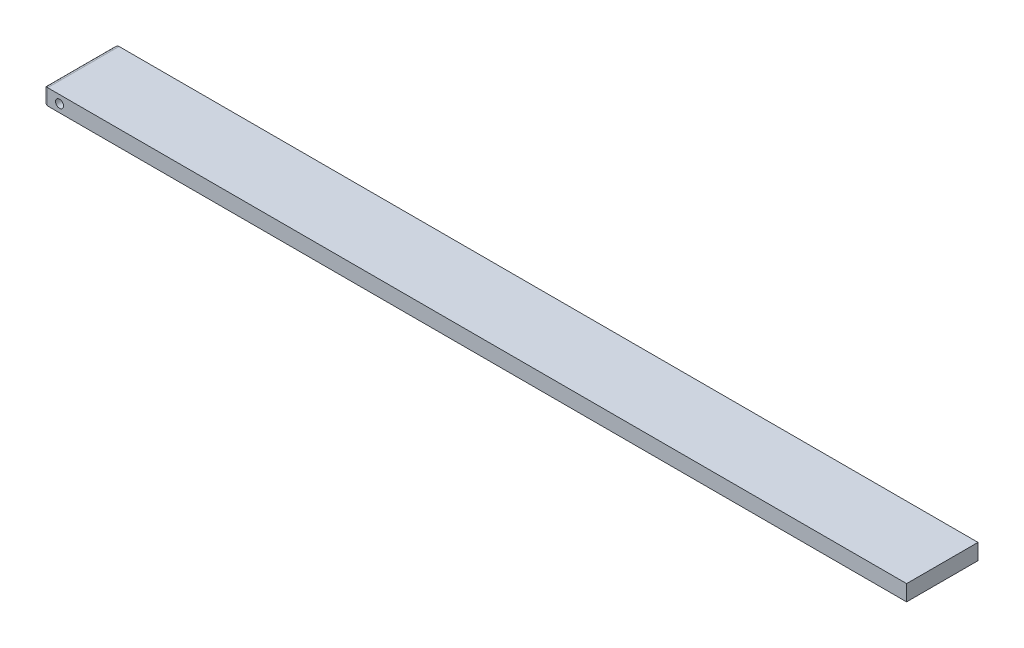
ISO-10303-21;
HEADER;
FILE_DESCRIPTION(('STEP AP214'),'2;1');
FILE_NAME('part.step','',(''),(''),'','','');
FILE_SCHEMA(('AUTOMOTIVE_DESIGN { 1 0 10303 214 1 1 1 1 }'));
ENDSEC;
DATA;
#1=APPLICATION_CONTEXT('core data for automotive mechanical design processes');
#2=APPLICATION_PROTOCOL_DEFINITION('international standard','automotive_design',2000,#1);
#3=PRODUCT_CONTEXT('',#1,'mechanical');
#4=PRODUCT('Part','Part','',(#3));
#5=PRODUCT_RELATED_PRODUCT_CATEGORY('part','',(#4));
#6=PRODUCT_DEFINITION_FORMATION('','',#4);
#7=PRODUCT_DEFINITION_CONTEXT('part definition',#1,'design');
#8=PRODUCT_DEFINITION('design','',#6,#7);
#9=PRODUCT_DEFINITION_SHAPE('','',#8);
#10=(LENGTH_UNIT() NAMED_UNIT(*) SI_UNIT(.MILLI.,.METRE.));
#11=(NAMED_UNIT(*) PLANE_ANGLE_UNIT() SI_UNIT($,.RADIAN.));
#12=(NAMED_UNIT(*) SI_UNIT($,.STERADIAN.) SOLID_ANGLE_UNIT());
#13=UNCERTAINTY_MEASURE_WITH_UNIT(LENGTH_MEASURE(1.E-05),#10,'distance_accuracy_value','');
#14=(GEOMETRIC_REPRESENTATION_CONTEXT(3) GLOBAL_UNCERTAINTY_ASSIGNED_CONTEXT((#13)) GLOBAL_UNIT_ASSIGNED_CONTEXT((#10,
#11,#12)) REPRESENTATION_CONTEXT('',''));
#15=CARTESIAN_POINT('',(0.,0.,0.));
#16=DIRECTION('',(0.,0.,1.));
#17=DIRECTION('',(1.,0.,0.));
#18=AXIS2_PLACEMENT_3D('',#15,#16,#17);
#19=CARTESIAN_POINT('',(5.16326384536586,-0.162855413686276,17.5470760664829));
#20=DIRECTION('',(0.,0.,1.));
#21=DIRECTION('',(1.,0.,0.));
#22=AXIS2_PLACEMENT_3D('',#19,#20,#21);
#23=PLANE('',#22);
#24=DIRECTION('',(-1.,0.,0.));
#25=VECTOR('',#24,1.);
#26=CARTESIAN_POINT('',(-84.5248728199298,2.98509455427488,17.5470760664829));
#27=LINE('',#26,#25);
#28=CARTESIAN_POINT('',(230.83872718007,2.98509455427513,17.5470760664829));
#29=VERTEX_POINT('',#28);
#30=CARTESIAN_POINT('',(-83.0751978199298,2.98509455427488,17.5470760664829));
#31=VERTEX_POINT('',#30);
#32=EDGE_CURVE('E88',#29,#31,#27,.T.);
#33=ORIENTED_EDGE('',*,*,#32,.T.);
#34=DIRECTION('',(0.,-1.,0.));
#35=VECTOR('',#34,1.);
#36=CARTESIAN_POINT('',(-83.0751978199298,-2.81360544572512,17.5470760664829));
#37=LINE('',#36,#35);
#38=CARTESIAN_POINT('',(-83.0751978199298,-2.81360544572512,17.5470760664829));
#39=VERTEX_POINT('',#38);
#40=EDGE_CURVE('E58',#31,#39,#37,.T.);
#41=ORIENTED_EDGE('',*,*,#40,.T.);
#42=DIRECTION('',(1.,0.,0.));
#43=VECTOR('',#42,1.);
#44=CARTESIAN_POINT('',(-84.5248728199298,-2.81360544572512,17.5470760664829));
#45=LINE('',#44,#43);
#46=CARTESIAN_POINT('',(230.83872718007,-2.81360544572487,17.5470760664829));
#47=VERTEX_POINT('',#46);
#48=EDGE_CURVE('E97',#39,#47,#45,.T.);
#49=ORIENTED_EDGE('',*,*,#48,.T.);
#50=DIRECTION('',(0.,-1.,0.));
#51=VECTOR('',#50,1.);
#52=CARTESIAN_POINT('',(230.83872718007,2.98509455427513,17.5470760664829));
#53=LINE('',#52,#51);
#54=EDGE_CURVE('E100',#29,#47,#53,.T.);
#55=ORIENTED_EDGE('',*,*,#54,.F.);
#56=EDGE_LOOP('',(#33,#41,#49,#55));
#57=FACE_BOUND('',#56,.T.);
#58=CARTESIAN_POINT('',(-78.7261728199297,0.0857445542748995,17.5470760664829));
#59=DIRECTION('',(0.,0.,1.));
#60=DIRECTION('',(1.,0.,0.));
#61=AXIS2_PLACEMENT_3D('',#58,#59,#60);
#62=CIRCLE('',#61,1.44967500000008);
#63=CARTESIAN_POINT('',(-77.2764978199296,0.0857445542748995,17.5470760664829));
#64=VERTEX_POINT('',#63);
#65=EDGE_CURVE('E116',#64,#64,#62,.T.);
#66=ORIENTED_EDGE('',*,*,#65,.F.);
#67=EDGE_LOOP('',(#66));
#68=FACE_BOUND('',#67,.T.);
#69=ADVANCED_FACE('F34',(#57,#68),#23,.T.);
#70=CARTESIAN_POINT('',(5.16326384536586,-0.162855413686276,-8.54707393351709));
#71=DIRECTION('',(0.,0.,1.));
#72=DIRECTION('',(1.,0.,0.));
#73=AXIS2_PLACEMENT_3D('',#70,#71,#72);
#74=PLANE('',#73);
#75=DIRECTION('',(1.,0.,0.));
#76=VECTOR('',#75,1.);
#77=CARTESIAN_POINT('',(-84.5248728199298,-2.81360544572512,-8.54707393351709));
#78=LINE('',#77,#76);
#79=CARTESIAN_POINT('',(-83.0751978199298,-2.81360544572512,-8.54707393351709));
#80=VERTEX_POINT('',#79);
#81=CARTESIAN_POINT('',(230.83872718007,-2.81360544572487,-8.54707393351709));
#82=VERTEX_POINT('',#81);
#83=EDGE_CURVE('E119',#80,#82,#78,.T.);
#84=ORIENTED_EDGE('',*,*,#83,.F.);
#85=DIRECTION('',(0.,-1.,0.));
#86=VECTOR('',#85,1.);
#87=CARTESIAN_POINT('',(-83.0751978199298,-0.162855413686276,-8.54707393351709));
#88=LINE('',#87,#86);
#89=CARTESIAN_POINT('',(-83.0751978199298,2.98509455427488,-8.54707393351709));
#90=VERTEX_POINT('',#89);
#91=EDGE_CURVE('E11',#80,#90,#88,.F.);
#92=ORIENTED_EDGE('',*,*,#91,.T.);
#93=DIRECTION('',(-1.,0.,0.));
#94=VECTOR('',#93,1.);
#95=CARTESIAN_POINT('',(-84.5248728199298,2.98509455427488,-8.54707393351709));
#96=LINE('',#95,#94);
#97=CARTESIAN_POINT('',(230.83872718007,2.98509455427513,-8.54707393351709));
#98=VERTEX_POINT('',#97);
#99=EDGE_CURVE('E123',#98,#90,#96,.T.);
#100=ORIENTED_EDGE('',*,*,#99,.F.);
#101=DIRECTION('',(0.,1.,0.));
#102=VECTOR('',#101,1.);
#103=CARTESIAN_POINT('',(230.83872718007,-2.81360544572487,-8.54707393351709));
#104=LINE('',#103,#102);
#105=EDGE_CURVE('E110',#82,#98,#104,.T.);
#106=ORIENTED_EDGE('',*,*,#105,.F.);
#107=EDGE_LOOP('',(#84,#92,#100,#106));
#108=FACE_BOUND('',#107,.T.);
#109=CARTESIAN_POINT('',(-78.7261728199297,0.0857445542748995,-8.54707393351709));
#110=DIRECTION('',(0.,0.,1.));
#111=DIRECTION('',(1.,0.,0.));
#112=AXIS2_PLACEMENT_3D('',#109,#110,#111);
#113=CIRCLE('',#112,1.44967500000008);
#114=CARTESIAN_POINT('',(-77.2764978199296,0.0857445542748995,-8.54707393351709));
#115=VERTEX_POINT('',#114);
#116=EDGE_CURVE('E120',#115,#115,#113,.T.);
#117=ORIENTED_EDGE('',*,*,#116,.T.);
#118=EDGE_LOOP('',(#117));
#119=FACE_BOUND('',#118,.T.);
#120=ADVANCED_FACE('F157',(#108,#119),#74,.F.);
#121=CARTESIAN_POINT('',(-84.5248728199298,2.98509455427488,17.5470760664829));
#122=DIRECTION('',(1.,0.,0.));
#123=DIRECTION('',(0.,0.,-1.));
#124=AXIS2_PLACEMENT_3D('',#121,#122,#123);
#125=PLANE('',#124);
#126=DIRECTION('',(0.,-1.,0.));
#127=VECTOR('',#126,1.);
#128=CARTESIAN_POINT('',(-84.5248728199298,2.98509455427488,16.0974010664829));
#129=LINE('',#128,#127);
#130=CARTESIAN_POINT('',(-84.5248728199298,-1.36393044572512,16.0974010664829));
#131=VERTEX_POINT('',#130);
#132=CARTESIAN_POINT('',(-84.5248728199298,1.53541955427488,16.0974010664829));
#133=VERTEX_POINT('',#132);
#134=EDGE_CURVE('E130',#131,#133,#129,.F.);
#135=ORIENTED_EDGE('',*,*,#134,.T.);
#136=DIRECTION('',(0.,0.,-1.));
#137=VECTOR('',#136,1.);
#138=CARTESIAN_POINT('',(-84.5248728199298,1.53541955427488,17.5470760664829));
#139=LINE('',#138,#137);
#140=CARTESIAN_POINT('',(-84.5248728199298,1.53541955427488,-7.09739893351709));
#141=VERTEX_POINT('',#140);
#142=EDGE_CURVE('E132',#133,#141,#139,.T.);
#143=ORIENTED_EDGE('',*,*,#142,.T.);
#144=DIRECTION('',(0.,-1.,0.));
#145=VECTOR('',#144,1.);
#146=CARTESIAN_POINT('',(-84.5248728199298,2.98509455427488,-7.09739893351709));
#147=LINE('',#146,#145);
#148=CARTESIAN_POINT('',(-84.5248728199298,-1.36393044572512,-7.09739893351709));
#149=VERTEX_POINT('',#148);
#150=EDGE_CURVE('E96',#141,#149,#147,.T.);
#151=ORIENTED_EDGE('',*,*,#150,.T.);
#152=DIRECTION('',(0.,0.,-1.));
#153=VECTOR('',#152,1.);
#154=CARTESIAN_POINT('',(-84.5248728199298,-1.36393044572512,17.5470760664829));
#155=LINE('',#154,#153);
#156=EDGE_CURVE('E128',#149,#131,#155,.F.);
#157=ORIENTED_EDGE('',*,*,#156,.T.);
#158=EDGE_LOOP('',(#135,#143,#151,#157));
#159=FACE_BOUND('',#158,.T.);
#160=ADVANCED_FACE('F163',(#159),#125,.F.);
#161=CARTESIAN_POINT('',(-84.5248728199298,-2.81360544572512,17.5470760664829));
#162=DIRECTION('',(0.,1.,0.));
#163=DIRECTION('',(-1.,0.,0.));
#164=AXIS2_PLACEMENT_3D('',#161,#162,#163);
#165=PLANE('',#164);
#166=ORIENTED_EDGE('',*,*,#48,.F.);
#167=DIRECTION('',(0.,0.,-1.));
#168=VECTOR('',#167,1.);
#169=CARTESIAN_POINT('',(-83.0751978199298,-2.81360544572512,17.5470760664829));
#170=LINE('',#169,#168);
#171=EDGE_CURVE('E43',#39,#80,#170,.T.);
#172=ORIENTED_EDGE('',*,*,#171,.T.);
#173=ORIENTED_EDGE('',*,*,#83,.T.);
#174=DIRECTION('',(0.,0.,-1.));
#175=VECTOR('',#174,1.);
#176=CARTESIAN_POINT('',(230.83872718007,-2.81360544572487,17.5470760664829));
#177=LINE('',#176,#175);
#178=EDGE_CURVE('E105',#47,#82,#177,.T.);
#179=ORIENTED_EDGE('',*,*,#178,.F.);
#180=EDGE_LOOP('',(#166,#172,#173,#179));
#181=FACE_BOUND('',#180,.T.);
#182=ADVANCED_FACE('F165',(#181),#165,.F.);
#183=CARTESIAN_POINT('',(-84.5248728199298,2.98509455427488,17.5470760664829));
#184=DIRECTION('',(0.,-1.,0.));
#185=DIRECTION('',(1.,0.,0.));
#186=AXIS2_PLACEMENT_3D('',#183,#184,#185);
#187=PLANE('',#186);
#188=ORIENTED_EDGE('',*,*,#99,.T.);
#189=DIRECTION('',(0.,0.,-1.));
#190=VECTOR('',#189,1.);
#191=CARTESIAN_POINT('',(-83.0751978199298,2.98509455427488,17.5470760664829));
#192=LINE('',#191,#190);
#193=EDGE_CURVE('E95',#90,#31,#192,.F.);
#194=ORIENTED_EDGE('',*,*,#193,.T.);
#195=ORIENTED_EDGE('',*,*,#32,.F.);
#196=DIRECTION('',(0.,0.,1.));
#197=VECTOR('',#196,1.);
#198=CARTESIAN_POINT('',(230.83872718007,2.98509455427513,-8.54707393351709));
#199=LINE('',#198,#197);
#200=EDGE_CURVE('E93',#98,#29,#199,.T.);
#201=ORIENTED_EDGE('',*,*,#200,.F.);
#202=EDGE_LOOP('',(#188,#194,#195,#201));
#203=FACE_BOUND('',#202,.T.);
#204=ADVANCED_FACE('F91',(#203),#187,.F.);
#205=CARTESIAN_POINT('',(-78.7261728199297,0.0857445542748995,17.5470760664829));
#206=DIRECTION('',(0.,0.,-1.));
#207=DIRECTION('',(-1.,0.,0.));
#208=AXIS2_PLACEMENT_3D('',#205,#206,#207);
#209=CYLINDRICAL_SURFACE('',#208,1.44967500000008);
#210=ORIENTED_EDGE('',*,*,#65,.T.);
#211=EDGE_LOOP('',(#210));
#212=FACE_BOUND('',#211,.T.);
#213=ORIENTED_EDGE('',*,*,#116,.F.);
#214=EDGE_LOOP('',(#213));
#215=FACE_BOUND('',#214,.T.);
#216=ADVANCED_FACE('F179',(#212,#215),#209,.F.);
#217=CARTESIAN_POINT('',(-83.0751978199298,-1.36393044572512,17.5470760664829));
#218=DIRECTION('',(0.,0.,-1.));
#219=DIRECTION('',(-1.,0.,0.));
#220=AXIS2_PLACEMENT_3D('',#217,#218,#219);
#221=CYLINDRICAL_SURFACE('',#220,1.449675);
#222=CARTESIAN_POINT('',(-83.0751978199298,-1.36393044572512,-7.09739893351709));
#223=DIRECTION('',(0.,-0.707106781186547,0.707106781186547));
#224=DIRECTION('',(0.,-0.707106781186547,-0.707106781186547));
#225=AXIS2_PLACEMENT_3D('',#222,#223,#224);
#226=ELLIPSE('',#225,2.05015004603322,1.449675);
#227=EDGE_CURVE('E140',#80,#149,#226,.F.);
#228=ORIENTED_EDGE('',*,*,#227,.F.);
#229=ORIENTED_EDGE('',*,*,#171,.F.);
#230=CARTESIAN_POINT('',(-83.0751978199298,-1.36393044572512,16.0974010664829));
#231=DIRECTION('',(0.,-0.707106781186547,-0.707106781186547));
#232=DIRECTION('',(0.,0.707106781186547,-0.707106781186547));
#233=AXIS2_PLACEMENT_3D('',#230,#231,#232);
#234=ELLIPSE('',#233,2.05015004603322,1.449675);
#235=EDGE_CURVE('E38',#131,#39,#234,.F.);
#236=ORIENTED_EDGE('',*,*,#235,.F.);
#237=ORIENTED_EDGE('',*,*,#156,.F.);
#238=EDGE_LOOP('',(#228,#229,#236,#237));
#239=FACE_BOUND('',#238,.T.);
#240=ADVANCED_FACE('F36',(#239),#221,.T.);
#241=CARTESIAN_POINT('',(-83.0751978199298,-0.162855413686276,16.0974010664829));
#242=DIRECTION('',(0.,1.,0.));
#243=DIRECTION('',(0.,0.,1.));
#244=AXIS2_PLACEMENT_3D('',#241,#242,#243);
#245=CYLINDRICAL_SURFACE('',#244,1.449675);
#246=ORIENTED_EDGE('',*,*,#235,.T.);
#247=ORIENTED_EDGE('',*,*,#40,.F.);
#248=CARTESIAN_POINT('',(-83.0751978199298,1.53541955427488,16.0974010664829));
#249=DIRECTION('',(0.,0.707106781186547,-0.707106781186547));
#250=DIRECTION('',(0.,0.707106781186547,0.707106781186547));
#251=AXIS2_PLACEMENT_3D('',#248,#249,#250);
#252=ELLIPSE('',#251,2.05015004603322,1.449675);
#253=EDGE_CURVE('E139',#133,#31,#252,.T.);
#254=ORIENTED_EDGE('',*,*,#253,.F.);
#255=ORIENTED_EDGE('',*,*,#134,.F.);
#256=EDGE_LOOP('',(#246,#247,#254,#255));
#257=FACE_BOUND('',#256,.T.);
#258=ADVANCED_FACE('F150',(#257),#245,.T.);
#259=CARTESIAN_POINT('',(-83.0751978199298,2.98509455427488,-7.09739893351709));
#260=DIRECTION('',(0.,-1.,0.));
#261=DIRECTION('',(0.,0.,-1.));
#262=AXIS2_PLACEMENT_3D('',#259,#260,#261);
#263=CYLINDRICAL_SURFACE('',#262,1.449675);
#264=ORIENTED_EDGE('',*,*,#227,.T.);
#265=ORIENTED_EDGE('',*,*,#150,.F.);
#266=CARTESIAN_POINT('',(-83.0751978199298,1.53541955427488,-7.09739893351709));
#267=DIRECTION('',(0.,-0.707106781186547,-0.707106781186547));
#268=DIRECTION('',(0.,-0.707106781186547,0.707106781186547));
#269=AXIS2_PLACEMENT_3D('',#266,#267,#268);
#270=ELLIPSE('',#269,2.05015004603322,1.449675);
#271=EDGE_CURVE('E115',#90,#141,#270,.F.);
#272=ORIENTED_EDGE('',*,*,#271,.F.);
#273=ORIENTED_EDGE('',*,*,#91,.F.);
#274=EDGE_LOOP('',(#264,#265,#272,#273));
#275=FACE_BOUND('',#274,.T.);
#276=ADVANCED_FACE('F155',(#275),#263,.T.);
#277=CARTESIAN_POINT('',(-83.0751978199298,1.53541955427488,17.5470760664829));
#278=DIRECTION('',(0.,0.,-1.));
#279=DIRECTION('',(-1.,0.,0.));
#280=AXIS2_PLACEMENT_3D('',#277,#278,#279);
#281=CYLINDRICAL_SURFACE('',#280,1.449675);
#282=ORIENTED_EDGE('',*,*,#253,.T.);
#283=ORIENTED_EDGE('',*,*,#193,.F.);
#284=ORIENTED_EDGE('',*,*,#271,.T.);
#285=ORIENTED_EDGE('',*,*,#142,.F.);
#286=EDGE_LOOP('',(#282,#283,#284,#285));
#287=FACE_BOUND('',#286,.T.);
#288=ADVANCED_FACE('F160',(#287),#281,.T.);
#289=CARTESIAN_POINT('',(230.83872718007,0.,0.));
#290=DIRECTION('',(1.,0.,0.));
#291=DIRECTION('',(0.,0.,-1.));
#292=AXIS2_PLACEMENT_3D('',#289,#290,#291);
#293=PLANE('',#292);
#294=ORIENTED_EDGE('',*,*,#200,.T.);
#295=ORIENTED_EDGE('',*,*,#54,.T.);
#296=ORIENTED_EDGE('',*,*,#178,.T.);
#297=ORIENTED_EDGE('',*,*,#105,.T.);
#298=EDGE_LOOP('',(#294,#295,#296,#297));
#299=FACE_BOUND('',#298,.T.);
#300=ADVANCED_FACE('F108',(#299),#293,.T.);
#301=CLOSED_SHELL('',(#69,#120,#160,#182,#204,#216,#240,#258,#276,#288,#300));
#302=MANIFOLD_SOLID_BREP('B2',#301);
#303=ADVANCED_BREP_SHAPE_REPRESENTATION('',(#18,#302),#14);
#304=SHAPE_DEFINITION_REPRESENTATION(#9,#303);
ENDSEC;
END-ISO-10303-21;
